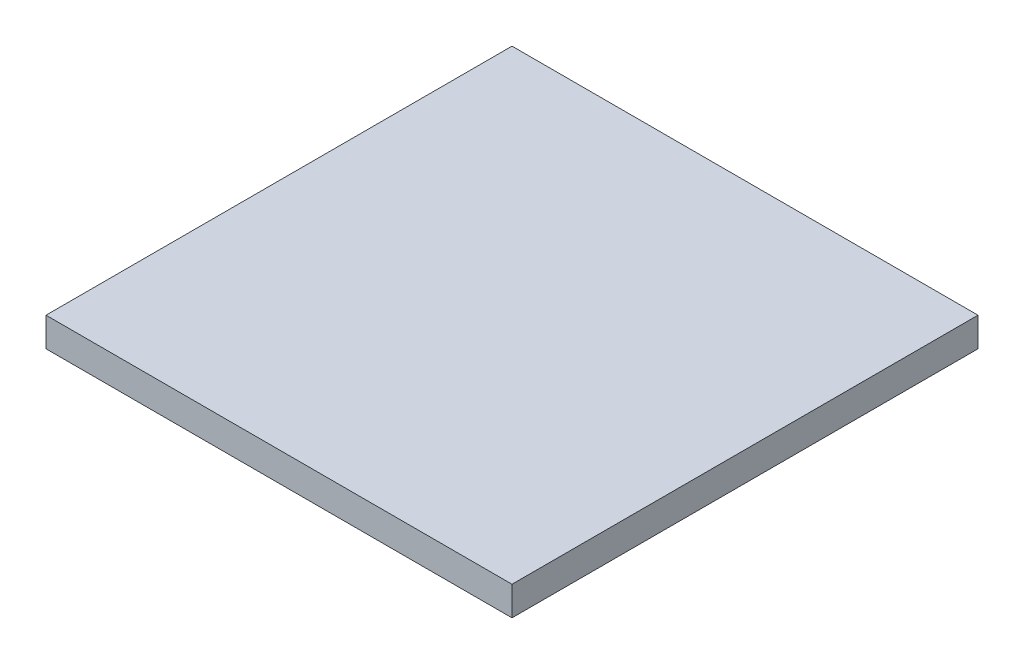
ISO-10303-21;
HEADER;
FILE_DESCRIPTION(('STEP AP214'),'2;1');
FILE_NAME('part.step','',(''),(''),'','','');
FILE_SCHEMA(('AUTOMOTIVE_DESIGN { 1 0 10303 214 1 1 1 1 }'));
ENDSEC;
DATA;
#1=APPLICATION_CONTEXT('core data for automotive mechanical design processes');
#2=APPLICATION_PROTOCOL_DEFINITION('international standard','automotive_design',2000,#1);
#3=PRODUCT_CONTEXT('',#1,'mechanical');
#4=PRODUCT('Part','Part','',(#3));
#5=PRODUCT_RELATED_PRODUCT_CATEGORY('part','',(#4));
#6=PRODUCT_DEFINITION_FORMATION('','',#4);
#7=PRODUCT_DEFINITION_CONTEXT('part definition',#1,'design');
#8=PRODUCT_DEFINITION('design','',#6,#7);
#9=PRODUCT_DEFINITION_SHAPE('','',#8);
#10=(LENGTH_UNIT() NAMED_UNIT(*) SI_UNIT(.MILLI.,.METRE.));
#11=(NAMED_UNIT(*) PLANE_ANGLE_UNIT() SI_UNIT($,.RADIAN.));
#12=(NAMED_UNIT(*) SI_UNIT($,.STERADIAN.) SOLID_ANGLE_UNIT());
#13=UNCERTAINTY_MEASURE_WITH_UNIT(LENGTH_MEASURE(1.E-05),#10,'distance_accuracy_value','');
#14=(GEOMETRIC_REPRESENTATION_CONTEXT(3) GLOBAL_UNCERTAINTY_ASSIGNED_CONTEXT((#13)) GLOBAL_UNIT_ASSIGNED_CONTEXT((#10,
#11,#12)) REPRESENTATION_CONTEXT('',''));
#15=CARTESIAN_POINT('',(0.,0.,0.));
#16=DIRECTION('',(0.,0.,1.));
#17=DIRECTION('',(1.,0.,0.));
#18=AXIS2_PLACEMENT_3D('',#15,#16,#17);
#19=CARTESIAN_POINT('',(0.,19.05,0.));
#20=DIRECTION('',(1.,0.,0.));
#21=DIRECTION('',(0.,0.,-1.));
#22=AXIS2_PLACEMENT_3D('',#19,#20,#21);
#23=PLANE('',#22);
#24=DIRECTION('',(0.,0.,1.));
#25=VECTOR('',#24,1.);
#26=CARTESIAN_POINT('',(0.,0.,0.));
#27=LINE('',#26,#25);
#28=CARTESIAN_POINT('',(0.,0.,0.));
#29=VERTEX_POINT('',#28);
#30=CARTESIAN_POINT('',(0.,0.,304.8));
#31=VERTEX_POINT('',#30);
#32=EDGE_CURVE('E97',#29,#31,#27,.T.);
#33=ORIENTED_EDGE('',*,*,#32,.T.);
#34=DIRECTION('',(0.,-1.,0.));
#35=VECTOR('',#34,1.);
#36=CARTESIAN_POINT('',(0.,19.05,304.8));
#37=LINE('',#36,#35);
#38=CARTESIAN_POINT('',(0.,19.05,304.8));
#39=VERTEX_POINT('',#38);
#40=EDGE_CURVE('E11',#39,#31,#37,.T.);
#41=ORIENTED_EDGE('',*,*,#40,.F.);
#42=DIRECTION('',(0.,0.,1.));
#43=VECTOR('',#42,1.);
#44=CARTESIAN_POINT('',(0.,19.05,0.));
#45=LINE('',#44,#43);
#46=CARTESIAN_POINT('',(0.,19.05,0.));
#47=VERTEX_POINT('',#46);
#48=EDGE_CURVE('E85',#47,#39,#45,.T.);
#49=ORIENTED_EDGE('',*,*,#48,.F.);
#50=DIRECTION('',(0.,-1.,0.));
#51=VECTOR('',#50,1.);
#52=CARTESIAN_POINT('',(0.,19.05,0.));
#53=LINE('',#52,#51);
#54=EDGE_CURVE('E93',#47,#29,#53,.T.);
#55=ORIENTED_EDGE('',*,*,#54,.T.);
#56=EDGE_LOOP('',(#33,#41,#49,#55));
#57=FACE_BOUND('',#56,.T.);
#58=ADVANCED_FACE('F34',(#57),#23,.F.);
#59=CARTESIAN_POINT('',(0.,19.05,304.8));
#60=DIRECTION('',(0.,0.,-1.));
#61=DIRECTION('',(-1.,0.,0.));
#62=AXIS2_PLACEMENT_3D('',#59,#60,#61);
#63=PLANE('',#62);
#64=DIRECTION('',(1.,0.,0.));
#65=VECTOR('',#64,1.);
#66=CARTESIAN_POINT('',(0.,0.,304.8));
#67=LINE('',#66,#65);
#68=CARTESIAN_POINT('',(304.8,0.,304.8));
#69=VERTEX_POINT('',#68);
#70=EDGE_CURVE('E89',#31,#69,#67,.T.);
#71=ORIENTED_EDGE('',*,*,#70,.T.);
#72=DIRECTION('',(0.,-1.,0.));
#73=VECTOR('',#72,1.);
#74=CARTESIAN_POINT('',(304.8,19.05,304.8));
#75=LINE('',#74,#73);
#76=CARTESIAN_POINT('',(304.8,19.05,304.8));
#77=VERTEX_POINT('',#76);
#78=EDGE_CURVE('E42',#77,#69,#75,.T.);
#79=ORIENTED_EDGE('',*,*,#78,.F.);
#80=DIRECTION('',(1.,0.,0.));
#81=VECTOR('',#80,1.);
#82=CARTESIAN_POINT('',(0.,19.05,304.8));
#83=LINE('',#82,#81);
#84=EDGE_CURVE('E80',#39,#77,#83,.T.);
#85=ORIENTED_EDGE('',*,*,#84,.F.);
#86=ORIENTED_EDGE('',*,*,#40,.T.);
#87=EDGE_LOOP('',(#71,#79,#85,#86));
#88=FACE_BOUND('',#87,.T.);
#89=ADVANCED_FACE('F88',(#88),#63,.F.);
#90=CARTESIAN_POINT('',(304.8,19.05,0.));
#91=DIRECTION('',(-1.,0.,0.));
#92=DIRECTION('',(0.,0.,1.));
#93=AXIS2_PLACEMENT_3D('',#90,#91,#92);
#94=PLANE('',#93);
#95=DIRECTION('',(0.,0.,-1.));
#96=VECTOR('',#95,1.);
#97=CARTESIAN_POINT('',(304.8,0.,0.));
#98=LINE('',#97,#96);
#99=CARTESIAN_POINT('',(304.8,0.,0.));
#100=VERTEX_POINT('',#99);
#101=EDGE_CURVE('E67',#69,#100,#98,.T.);
#102=ORIENTED_EDGE('',*,*,#101,.T.);
#103=DIRECTION('',(0.,-1.,0.));
#104=VECTOR('',#103,1.);
#105=CARTESIAN_POINT('',(304.8,19.05,0.));
#106=LINE('',#105,#104);
#107=CARTESIAN_POINT('',(304.8,19.05,0.));
#108=VERTEX_POINT('',#107);
#109=EDGE_CURVE('E90',#108,#100,#106,.T.);
#110=ORIENTED_EDGE('',*,*,#109,.F.);
#111=DIRECTION('',(0.,0.,-1.));
#112=VECTOR('',#111,1.);
#113=CARTESIAN_POINT('',(304.8,19.05,0.));
#114=LINE('',#113,#112);
#115=EDGE_CURVE('E83',#77,#108,#114,.T.);
#116=ORIENTED_EDGE('',*,*,#115,.F.);
#117=ORIENTED_EDGE('',*,*,#78,.T.);
#118=EDGE_LOOP('',(#102,#110,#116,#117));
#119=FACE_BOUND('',#118,.T.);
#120=ADVANCED_FACE('F91',(#119),#94,.F.);
#121=CARTESIAN_POINT('',(0.,19.05,0.));
#122=DIRECTION('',(0.,0.,1.));
#123=DIRECTION('',(1.,0.,0.));
#124=AXIS2_PLACEMENT_3D('',#121,#122,#123);
#125=PLANE('',#124);
#126=DIRECTION('',(-1.,0.,0.));
#127=VECTOR('',#126,1.);
#128=CARTESIAN_POINT('',(0.,0.,0.));
#129=LINE('',#128,#127);
#130=EDGE_CURVE('E73',#100,#29,#129,.T.);
#131=ORIENTED_EDGE('',*,*,#130,.T.);
#132=ORIENTED_EDGE('',*,*,#54,.F.);
#133=DIRECTION('',(-1.,0.,0.));
#134=VECTOR('',#133,1.);
#135=CARTESIAN_POINT('',(0.,19.05,0.));
#136=LINE('',#135,#134);
#137=EDGE_CURVE('E50',#108,#47,#136,.T.);
#138=ORIENTED_EDGE('',*,*,#137,.F.);
#139=ORIENTED_EDGE('',*,*,#109,.T.);
#140=EDGE_LOOP('',(#131,#132,#138,#139));
#141=FACE_BOUND('',#140,.T.);
#142=ADVANCED_FACE('F104',(#141),#125,.F.);
#143=CARTESIAN_POINT('',(0.,19.05,0.));
#144=DIRECTION('',(0.,1.,0.));
#145=DIRECTION('',(0.,0.,1.));
#146=AXIS2_PLACEMENT_3D('',#143,#144,#145);
#147=PLANE('',#146);
#148=ORIENTED_EDGE('',*,*,#48,.T.);
#149=ORIENTED_EDGE('',*,*,#84,.T.);
#150=ORIENTED_EDGE('',*,*,#115,.T.);
#151=ORIENTED_EDGE('',*,*,#137,.T.);
#152=EDGE_LOOP('',(#148,#149,#150,#151));
#153=FACE_BOUND('',#152,.T.);
#154=ADVANCED_FACE('F81',(#153),#147,.T.);
#155=CARTESIAN_POINT('',(0.,0.,0.));
#156=DIRECTION('',(0.,1.,0.));
#157=DIRECTION('',(0.,0.,1.));
#158=AXIS2_PLACEMENT_3D('',#155,#156,#157);
#159=PLANE('',#158);
#160=ORIENTED_EDGE('',*,*,#32,.F.);
#161=ORIENTED_EDGE('',*,*,#130,.F.);
#162=ORIENTED_EDGE('',*,*,#101,.F.);
#163=ORIENTED_EDGE('',*,*,#70,.F.);
#164=EDGE_LOOP('',(#160,#161,#162,#163));
#165=FACE_BOUND('',#164,.T.);
#166=ADVANCED_FACE('F107',(#165),#159,.F.);
#167=CLOSED_SHELL('',(#58,#89,#120,#142,#154,#166));
#168=MANIFOLD_SOLID_BREP('B2',#167);
#169=ADVANCED_BREP_SHAPE_REPRESENTATION('',(#18,#168),#14);
#170=SHAPE_DEFINITION_REPRESENTATION(#9,#169);
ENDSEC;
END-ISO-10303-21;
